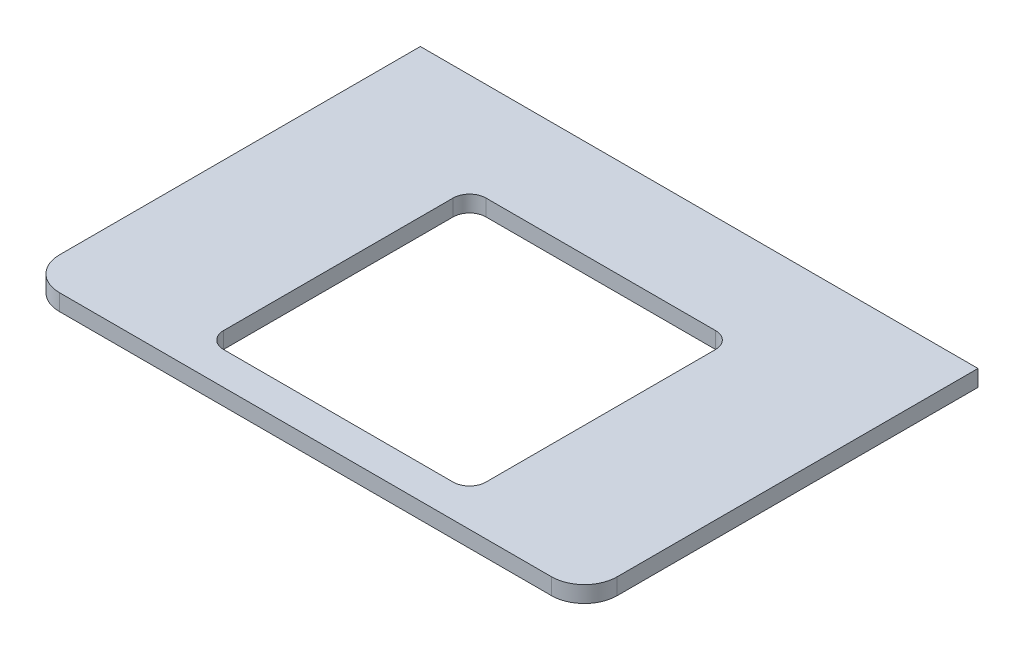
ISO-10303-21;
HEADER;
FILE_DESCRIPTION(('STEP AP214'),'2;1');
FILE_NAME('part.step','',(''),(''),'','','');
FILE_SCHEMA(('AUTOMOTIVE_DESIGN { 1 0 10303 214 1 1 1 1 }'));
ENDSEC;
DATA;
#1=APPLICATION_CONTEXT('core data for automotive mechanical design processes');
#2=APPLICATION_PROTOCOL_DEFINITION('international standard','automotive_design',2000,#1);
#3=PRODUCT_CONTEXT('',#1,'mechanical');
#4=PRODUCT('Part','Part','',(#3));
#5=PRODUCT_RELATED_PRODUCT_CATEGORY('part','',(#4));
#6=PRODUCT_DEFINITION_FORMATION('','',#4);
#7=PRODUCT_DEFINITION_CONTEXT('part definition',#1,'design');
#8=PRODUCT_DEFINITION('design','',#6,#7);
#9=PRODUCT_DEFINITION_SHAPE('','',#8);
#10=(LENGTH_UNIT() NAMED_UNIT(*) SI_UNIT(.MILLI.,.METRE.));
#11=(NAMED_UNIT(*) PLANE_ANGLE_UNIT() SI_UNIT($,.RADIAN.));
#12=(NAMED_UNIT(*) SI_UNIT($,.STERADIAN.) SOLID_ANGLE_UNIT());
#13=UNCERTAINTY_MEASURE_WITH_UNIT(LENGTH_MEASURE(1.E-05),#10,'distance_accuracy_value','');
#14=(GEOMETRIC_REPRESENTATION_CONTEXT(3) GLOBAL_UNCERTAINTY_ASSIGNED_CONTEXT((#13)) GLOBAL_UNIT_ASSIGNED_CONTEXT((#10,
#11,#12)) REPRESENTATION_CONTEXT('',''));
#15=CARTESIAN_POINT('',(0.,0.,0.));
#16=DIRECTION('',(0.,0.,1.));
#17=DIRECTION('',(1.,0.,0.));
#18=AXIS2_PLACEMENT_3D('',#15,#16,#17);
#19=CARTESIAN_POINT('',(107.95,6.35,-76.2));
#20=DIRECTION('',(-1.,0.,0.));
#21=DIRECTION('',(0.,0.,1.));
#22=AXIS2_PLACEMENT_3D('',#19,#20,#21);
#23=PLANE('',#22);
#24=DIRECTION('',(0.,0.,-1.));
#25=VECTOR('',#24,1.);
#26=CARTESIAN_POINT('',(107.95,6.35,-76.2));
#27=LINE('',#26,#25);
#28=CARTESIAN_POINT('',(107.95,6.35,63.4999999999999));
#29=VERTEX_POINT('',#28);
#30=CARTESIAN_POINT('',(107.95,6.35,-76.2));
#31=VERTEX_POINT('',#30);
#32=EDGE_CURVE('E233',#29,#31,#27,.T.);
#33=ORIENTED_EDGE('',*,*,#32,.F.);
#34=DIRECTION('',(0.,-1.,0.));
#35=VECTOR('',#34,1.);
#36=CARTESIAN_POINT('',(107.95,6.35,63.5));
#37=LINE('',#36,#35);
#38=CARTESIAN_POINT('',(107.95,0.,63.4999999999999));
#39=VERTEX_POINT('',#38);
#40=EDGE_CURVE('E268',#29,#39,#37,.T.);
#41=ORIENTED_EDGE('',*,*,#40,.T.);
#42=DIRECTION('',(0.,0.,-1.));
#43=VECTOR('',#42,1.);
#44=CARTESIAN_POINT('',(107.95,0.,-76.2));
#45=LINE('',#44,#43);
#46=CARTESIAN_POINT('',(107.95,0.,-76.2));
#47=VERTEX_POINT('',#46);
#48=EDGE_CURVE('E215',#39,#47,#45,.T.);
#49=ORIENTED_EDGE('',*,*,#48,.T.);
#50=DIRECTION('',(0.,-1.,0.));
#51=VECTOR('',#50,1.);
#52=CARTESIAN_POINT('',(107.95,6.35,-76.2));
#53=LINE('',#52,#51);
#54=EDGE_CURVE('E264',#31,#47,#53,.T.);
#55=ORIENTED_EDGE('',*,*,#54,.F.);
#56=EDGE_LOOP('',(#33,#41,#49,#55));
#57=FACE_BOUND('',#56,.T.);
#58=ADVANCED_FACE('F39',(#57),#23,.F.);
#59=CARTESIAN_POINT('',(-107.95,6.35,-76.2));
#60=DIRECTION('',(0.,0.,1.));
#61=DIRECTION('',(1.,0.,0.));
#62=AXIS2_PLACEMENT_3D('',#59,#60,#61);
#63=PLANE('',#62);
#64=DIRECTION('',(-1.,0.,0.));
#65=VECTOR('',#64,1.);
#66=CARTESIAN_POINT('',(-107.95,0.,-76.2));
#67=LINE('',#66,#65);
#68=CARTESIAN_POINT('',(-107.95,0.,-76.2));
#69=VERTEX_POINT('',#68);
#70=EDGE_CURVE('E251',#47,#69,#67,.T.);
#71=ORIENTED_EDGE('',*,*,#70,.T.);
#72=DIRECTION('',(0.,-1.,0.));
#73=VECTOR('',#72,1.);
#74=CARTESIAN_POINT('',(-107.95,6.35,-76.2));
#75=LINE('',#74,#73);
#76=CARTESIAN_POINT('',(-107.95,6.35,-76.2));
#77=VERTEX_POINT('',#76);
#78=EDGE_CURVE('E248',#77,#69,#75,.T.);
#79=ORIENTED_EDGE('',*,*,#78,.F.);
#80=DIRECTION('',(-1.,0.,0.));
#81=VECTOR('',#80,1.);
#82=CARTESIAN_POINT('',(-107.95,6.35,-76.2));
#83=LINE('',#82,#81);
#84=EDGE_CURVE('E236',#31,#77,#83,.T.);
#85=ORIENTED_EDGE('',*,*,#84,.F.);
#86=ORIENTED_EDGE('',*,*,#54,.T.);
#87=EDGE_LOOP('',(#71,#79,#85,#86));
#88=FACE_BOUND('',#87,.T.);
#89=ADVANCED_FACE('F315',(#88),#63,.F.);
#90=CARTESIAN_POINT('',(-107.95,6.35,-76.2));
#91=DIRECTION('',(1.,0.,0.));
#92=DIRECTION('',(0.,0.,-1.));
#93=AXIS2_PLACEMENT_3D('',#90,#91,#92);
#94=PLANE('',#93);
#95=DIRECTION('',(0.,0.,1.));
#96=VECTOR('',#95,1.);
#97=CARTESIAN_POINT('',(-107.95,0.,-76.2));
#98=LINE('',#97,#96);
#99=CARTESIAN_POINT('',(-107.95,0.,63.4999999999999));
#100=VERTEX_POINT('',#99);
#101=EDGE_CURVE('E254',#69,#100,#98,.T.);
#102=ORIENTED_EDGE('',*,*,#101,.T.);
#103=DIRECTION('',(0.,-1.,0.));
#104=VECTOR('',#103,1.);
#105=CARTESIAN_POINT('',(-107.95,6.35,63.5));
#106=LINE('',#105,#104);
#107=CARTESIAN_POINT('',(-107.95,6.35,63.4999999999999));
#108=VERTEX_POINT('',#107);
#109=EDGE_CURVE('E11',#100,#108,#106,.F.);
#110=ORIENTED_EDGE('',*,*,#109,.T.);
#111=DIRECTION('',(0.,0.,1.));
#112=VECTOR('',#111,1.);
#113=CARTESIAN_POINT('',(-107.95,6.35,-76.2));
#114=LINE('',#113,#112);
#115=EDGE_CURVE('E240',#77,#108,#114,.T.);
#116=ORIENTED_EDGE('',*,*,#115,.F.);
#117=ORIENTED_EDGE('',*,*,#78,.T.);
#118=EDGE_LOOP('',(#102,#110,#116,#117));
#119=FACE_BOUND('',#118,.T.);
#120=ADVANCED_FACE('F311',(#119),#94,.F.);
#121=CARTESIAN_POINT('',(-107.95,6.35,76.2));
#122=DIRECTION('',(0.,0.,-1.));
#123=DIRECTION('',(-1.,0.,0.));
#124=AXIS2_PLACEMENT_3D('',#121,#122,#123);
#125=PLANE('',#124);
#126=DIRECTION('',(1.,0.,0.));
#127=VECTOR('',#126,1.);
#128=CARTESIAN_POINT('',(-107.95,0.,76.2));
#129=LINE('',#128,#127);
#130=CARTESIAN_POINT('',(-95.25,0.,76.2));
#131=VERTEX_POINT('',#130);
#132=CARTESIAN_POINT('',(95.25,0.,76.2));
#133=VERTEX_POINT('',#132);
#134=EDGE_CURVE('E237',#131,#133,#129,.T.);
#135=ORIENTED_EDGE('',*,*,#134,.T.);
#136=DIRECTION('',(0.,-1.,0.));
#137=VECTOR('',#136,1.);
#138=CARTESIAN_POINT('',(95.25,6.35,76.2));
#139=LINE('',#138,#137);
#140=CARTESIAN_POINT('',(95.25,6.35,76.2));
#141=VERTEX_POINT('',#140);
#142=EDGE_CURVE('E282',#133,#141,#139,.F.);
#143=ORIENTED_EDGE('',*,*,#142,.T.);
#144=DIRECTION('',(1.,0.,0.));
#145=VECTOR('',#144,1.);
#146=CARTESIAN_POINT('',(-107.95,6.35,76.2));
#147=LINE('',#146,#145);
#148=CARTESIAN_POINT('',(-95.25,6.35,76.2));
#149=VERTEX_POINT('',#148);
#150=EDGE_CURVE('E244',#149,#141,#147,.T.);
#151=ORIENTED_EDGE('',*,*,#150,.F.);
#152=DIRECTION('',(0.,-1.,0.));
#153=VECTOR('',#152,1.);
#154=CARTESIAN_POINT('',(-95.25,6.35,76.2));
#155=LINE('',#154,#153);
#156=EDGE_CURVE('E278',#149,#131,#155,.T.);
#157=ORIENTED_EDGE('',*,*,#156,.T.);
#158=EDGE_LOOP('',(#135,#143,#151,#157));
#159=FACE_BOUND('',#158,.T.);
#160=ADVANCED_FACE('F304',(#159),#125,.F.);
#161=CARTESIAN_POINT('',(0.,6.35,0.));
#162=DIRECTION('',(0.,1.,0.));
#163=DIRECTION('',(0.,0.,1.));
#164=AXIS2_PLACEMENT_3D('',#161,#162,#163);
#165=PLANE('',#164);
#166=CARTESIAN_POINT('',(44.45,6.35,-31.75));
#167=DIRECTION('',(0.,1.,0.));
#168=DIRECTION('',(0.,0.,-1.));
#169=AXIS2_PLACEMENT_3D('',#166,#167,#168);
#170=CIRCLE('',#169,6.35);
#171=CARTESIAN_POINT('',(50.8,6.35,-31.75));
#172=VERTEX_POINT('',#171);
#173=CARTESIAN_POINT('',(44.45,6.35,-38.1));
#174=VERTEX_POINT('',#173);
#175=EDGE_CURVE('E55',#172,#174,#170,.T.);
#176=ORIENTED_EDGE('',*,*,#175,.F.);
#177=DIRECTION('',(0.,0.,-1.));
#178=VECTOR('',#177,1.);
#179=CARTESIAN_POINT('',(50.8,6.35,-31.75));
#180=LINE('',#179,#178);
#181=CARTESIAN_POINT('',(50.8000000000001,6.35,57.1499999999999));
#182=VERTEX_POINT('',#181);
#183=EDGE_CURVE('E162',#182,#172,#180,.T.);
#184=ORIENTED_EDGE('',*,*,#183,.F.);
#185=CARTESIAN_POINT('',(44.4500000000001,6.35,57.15));
#186=DIRECTION('',(0.,1.,0.));
#187=DIRECTION('',(0.,0.,1.));
#188=AXIS2_PLACEMENT_3D('',#185,#186,#187);
#189=CIRCLE('',#188,6.34999999999999);
#190=CARTESIAN_POINT('',(44.45,6.35,63.5));
#191=VERTEX_POINT('',#190);
#192=EDGE_CURVE('E166',#191,#182,#189,.T.);
#193=ORIENTED_EDGE('',*,*,#192,.F.);
#194=DIRECTION('',(1.,0.,0.));
#195=VECTOR('',#194,1.);
#196=CARTESIAN_POINT('',(-44.4499999999998,6.35,63.5));
#197=LINE('',#196,#195);
#198=CARTESIAN_POINT('',(-44.4499999999999,6.35,63.5));
#199=VERTEX_POINT('',#198);
#200=EDGE_CURVE('E205',#199,#191,#197,.T.);
#201=ORIENTED_EDGE('',*,*,#200,.F.);
#202=CARTESIAN_POINT('',(-44.4499999999999,6.35,57.15));
#203=DIRECTION('',(0.,1.,0.));
#204=DIRECTION('',(0.,0.,1.));
#205=AXIS2_PLACEMENT_3D('',#202,#203,#204);
#206=CIRCLE('',#205,6.35);
#207=CARTESIAN_POINT('',(-50.7999999999998,6.35,57.1499999999999));
#208=VERTEX_POINT('',#207);
#209=EDGE_CURVE('E201',#208,#199,#206,.T.);
#210=ORIENTED_EDGE('',*,*,#209,.F.);
#211=DIRECTION('',(0.,0.,1.));
#212=VECTOR('',#211,1.);
#213=CARTESIAN_POINT('',(-50.7999999999999,6.35,-31.75));
#214=LINE('',#213,#212);
#215=CARTESIAN_POINT('',(-50.7999999999999,6.35,-31.75));
#216=VERTEX_POINT('',#215);
#217=EDGE_CURVE('E197',#216,#208,#214,.T.);
#218=ORIENTED_EDGE('',*,*,#217,.F.);
#219=CARTESIAN_POINT('',(-44.4499999999999,6.35,-31.75));
#220=DIRECTION('',(0.,1.,0.));
#221=DIRECTION('',(0.,0.,1.));
#222=AXIS2_PLACEMENT_3D('',#219,#220,#221);
#223=CIRCLE('',#222,6.34999999999999);
#224=CARTESIAN_POINT('',(-44.4499999999998,6.35,-38.1));
#225=VERTEX_POINT('',#224);
#226=EDGE_CURVE('E193',#225,#216,#223,.T.);
#227=ORIENTED_EDGE('',*,*,#226,.F.);
#228=DIRECTION('',(-1.,0.,0.));
#229=VECTOR('',#228,1.);
#230=CARTESIAN_POINT('',(-44.4499999999998,6.35,-38.1));
#231=LINE('',#230,#229);
#232=EDGE_CURVE('E190',#174,#225,#231,.T.);
#233=ORIENTED_EDGE('',*,*,#232,.F.);
#234=EDGE_LOOP('',(#176,#184,#193,#201,#210,#218,#227,#233));
#235=FACE_BOUND('',#234,.T.);
#236=ORIENTED_EDGE('',*,*,#150,.T.);
#237=CARTESIAN_POINT('',(95.25,6.35,63.5));
#238=DIRECTION('',(0.,1.,0.));
#239=DIRECTION('',(0.,0.,1.));
#240=AXIS2_PLACEMENT_3D('',#237,#238,#239);
#241=CIRCLE('',#240,12.7);
#242=EDGE_CURVE('E48',#141,#29,#241,.T.);
#243=ORIENTED_EDGE('',*,*,#242,.T.);
#244=ORIENTED_EDGE('',*,*,#32,.T.);
#245=ORIENTED_EDGE('',*,*,#84,.T.);
#246=ORIENTED_EDGE('',*,*,#115,.T.);
#247=CARTESIAN_POINT('',(-95.25,6.35,63.5));
#248=DIRECTION('',(0.,1.,0.));
#249=DIRECTION('',(0.,0.,1.));
#250=AXIS2_PLACEMENT_3D('',#247,#248,#249);
#251=CIRCLE('',#250,12.7);
#252=EDGE_CURVE('E285',#108,#149,#251,.T.);
#253=ORIENTED_EDGE('',*,*,#252,.T.);
#254=EDGE_LOOP('',(#236,#243,#244,#245,#246,#253));
#255=FACE_BOUND('',#254,.T.);
#256=ADVANCED_FACE('F291',(#235,#255),#165,.T.);
#257=CARTESIAN_POINT('',(0.,0.,0.));
#258=DIRECTION('',(0.,1.,0.));
#259=DIRECTION('',(0.,0.,1.));
#260=AXIS2_PLACEMENT_3D('',#257,#258,#259);
#261=PLANE('',#260);
#262=DIRECTION('',(0.,0.,-1.));
#263=VECTOR('',#262,1.);
#264=CARTESIAN_POINT('',(50.8,0.,-31.75));
#265=LINE('',#264,#263);
#266=CARTESIAN_POINT('',(50.8000000000001,0.,57.1499999999999));
#267=VERTEX_POINT('',#266);
#268=CARTESIAN_POINT('',(50.8,0.,-31.75));
#269=VERTEX_POINT('',#268);
#270=EDGE_CURVE('E149',#267,#269,#265,.T.);
#271=ORIENTED_EDGE('',*,*,#270,.T.);
#272=CARTESIAN_POINT('',(44.45,0.,-31.75));
#273=DIRECTION('',(0.,1.,0.));
#274=DIRECTION('',(0.,0.,-1.));
#275=AXIS2_PLACEMENT_3D('',#272,#273,#274);
#276=CIRCLE('',#275,6.35);
#277=CARTESIAN_POINT('',(44.45,0.,-38.1));
#278=VERTEX_POINT('',#277);
#279=EDGE_CURVE('E142',#269,#278,#276,.T.);
#280=ORIENTED_EDGE('',*,*,#279,.T.);
#281=DIRECTION('',(-1.,0.,0.));
#282=VECTOR('',#281,1.);
#283=CARTESIAN_POINT('',(-44.4499999999998,0.,-38.1));
#284=LINE('',#283,#282);
#285=CARTESIAN_POINT('',(-44.4499999999998,0.,-38.1));
#286=VERTEX_POINT('',#285);
#287=EDGE_CURVE('E152',#278,#286,#284,.T.);
#288=ORIENTED_EDGE('',*,*,#287,.T.);
#289=CARTESIAN_POINT('',(-44.4499999999999,0.,-31.75));
#290=DIRECTION('',(0.,1.,0.));
#291=DIRECTION('',(0.,0.,1.));
#292=AXIS2_PLACEMENT_3D('',#289,#290,#291);
#293=CIRCLE('',#292,6.34999999999999);
#294=CARTESIAN_POINT('',(-50.7999999999999,0.,-31.75));
#295=VERTEX_POINT('',#294);
#296=EDGE_CURVE('E63',#286,#295,#293,.T.);
#297=ORIENTED_EDGE('',*,*,#296,.T.);
#298=DIRECTION('',(0.,0.,1.));
#299=VECTOR('',#298,1.);
#300=CARTESIAN_POINT('',(-50.7999999999999,0.,-31.75));
#301=LINE('',#300,#299);
#302=CARTESIAN_POINT('',(-50.7999999999998,0.,57.1499999999999));
#303=VERTEX_POINT('',#302);
#304=EDGE_CURVE('E171',#295,#303,#301,.T.);
#305=ORIENTED_EDGE('',*,*,#304,.T.);
#306=CARTESIAN_POINT('',(-44.4499999999999,0.,57.15));
#307=DIRECTION('',(0.,1.,0.));
#308=DIRECTION('',(0.,0.,1.));
#309=AXIS2_PLACEMENT_3D('',#306,#307,#308);
#310=CIRCLE('',#309,6.35);
#311=CARTESIAN_POINT('',(-44.4499999999999,0.,63.5));
#312=VERTEX_POINT('',#311);
#313=EDGE_CURVE('E175',#303,#312,#310,.T.);
#314=ORIENTED_EDGE('',*,*,#313,.T.);
#315=DIRECTION('',(1.,0.,0.));
#316=VECTOR('',#315,1.);
#317=CARTESIAN_POINT('',(-44.4499999999998,0.,63.5));
#318=LINE('',#317,#316);
#319=CARTESIAN_POINT('',(44.45,0.,63.5));
#320=VERTEX_POINT('',#319);
#321=EDGE_CURVE('E179',#312,#320,#318,.T.);
#322=ORIENTED_EDGE('',*,*,#321,.T.);
#323=CARTESIAN_POINT('',(44.4500000000001,0.,57.15));
#324=DIRECTION('',(0.,1.,0.));
#325=DIRECTION('',(0.,0.,1.));
#326=AXIS2_PLACEMENT_3D('',#323,#324,#325);
#327=CIRCLE('',#326,6.34999999999999);
#328=EDGE_CURVE('E183',#320,#267,#327,.T.);
#329=ORIENTED_EDGE('',*,*,#328,.T.);
#330=EDGE_LOOP('',(#271,#280,#288,#297,#305,#314,#322,#329));
#331=FACE_BOUND('',#330,.T.);
#332=ORIENTED_EDGE('',*,*,#48,.F.);
#333=CARTESIAN_POINT('',(95.25,0.,63.5));
#334=DIRECTION('',(0.,1.,0.));
#335=DIRECTION('',(0.,0.,1.));
#336=AXIS2_PLACEMENT_3D('',#333,#334,#335);
#337=CIRCLE('',#336,12.7);
#338=EDGE_CURVE('E275',#39,#133,#337,.F.);
#339=ORIENTED_EDGE('',*,*,#338,.T.);
#340=ORIENTED_EDGE('',*,*,#134,.F.);
#341=CARTESIAN_POINT('',(-95.25,0.,63.5));
#342=DIRECTION('',(0.,1.,0.));
#343=DIRECTION('',(0.,0.,1.));
#344=AXIS2_PLACEMENT_3D('',#341,#342,#343);
#345=CIRCLE('',#344,12.7);
#346=EDGE_CURVE('E272',#131,#100,#345,.F.);
#347=ORIENTED_EDGE('',*,*,#346,.T.);
#348=ORIENTED_EDGE('',*,*,#101,.F.);
#349=ORIENTED_EDGE('',*,*,#70,.F.);
#350=EDGE_LOOP('',(#332,#339,#340,#347,#348,#349));
#351=FACE_BOUND('',#350,.T.);
#352=ADVANCED_FACE('F157',(#331,#351),#261,.F.);
#353=CARTESIAN_POINT('',(95.25,6.35,63.5));
#354=DIRECTION('',(0.,-1.,0.));
#355=DIRECTION('',(0.,0.,-1.));
#356=AXIS2_PLACEMENT_3D('',#353,#354,#355);
#357=CYLINDRICAL_SURFACE('',#356,12.7);
#358=ORIENTED_EDGE('',*,*,#242,.F.);
#359=ORIENTED_EDGE('',*,*,#142,.F.);
#360=ORIENTED_EDGE('',*,*,#338,.F.);
#361=ORIENTED_EDGE('',*,*,#40,.F.);
#362=EDGE_LOOP('',(#358,#359,#360,#361));
#363=FACE_BOUND('',#362,.T.);
#364=ADVANCED_FACE('F300',(#363),#357,.T.);
#365=CARTESIAN_POINT('',(-95.25,6.35,63.5));
#366=DIRECTION('',(0.,-1.,0.));
#367=DIRECTION('',(0.,0.,-1.));
#368=AXIS2_PLACEMENT_3D('',#365,#366,#367);
#369=CYLINDRICAL_SURFACE('',#368,12.7);
#370=ORIENTED_EDGE('',*,*,#252,.F.);
#371=ORIENTED_EDGE('',*,*,#109,.F.);
#372=ORIENTED_EDGE('',*,*,#346,.F.);
#373=ORIENTED_EDGE('',*,*,#156,.F.);
#374=EDGE_LOOP('',(#370,#371,#372,#373));
#375=FACE_BOUND('',#374,.T.);
#376=ADVANCED_FACE('F41',(#375),#369,.T.);
#377=CARTESIAN_POINT('',(44.45,0.,-31.75));
#378=DIRECTION('',(0.,1.,0.));
#379=DIRECTION('',(0.,0.,1.));
#380=AXIS2_PLACEMENT_3D('',#377,#378,#379);
#381=CYLINDRICAL_SURFACE('',#380,6.35);
#382=ORIENTED_EDGE('',*,*,#175,.T.);
#383=DIRECTION('',(0.,1.,0.));
#384=VECTOR('',#383,1.);
#385=CARTESIAN_POINT('',(44.45,0.,-38.1));
#386=LINE('',#385,#384);
#387=EDGE_CURVE('E138',#278,#174,#386,.T.);
#388=ORIENTED_EDGE('',*,*,#387,.F.);
#389=ORIENTED_EDGE('',*,*,#279,.F.);
#390=DIRECTION('',(0.,1.,0.));
#391=VECTOR('',#390,1.);
#392=CARTESIAN_POINT('',(50.8,0.,-31.75));
#393=LINE('',#392,#391);
#394=EDGE_CURVE('E212',#269,#172,#393,.T.);
#395=ORIENTED_EDGE('',*,*,#394,.T.);
#396=EDGE_LOOP('',(#382,#388,#389,#395));
#397=FACE_BOUND('',#396,.T.);
#398=ADVANCED_FACE('F140',(#397),#381,.F.);
#399=CARTESIAN_POINT('',(50.8,0.,-31.75));
#400=DIRECTION('',(1.,0.,0.));
#401=DIRECTION('',(0.,0.,-1.));
#402=AXIS2_PLACEMENT_3D('',#399,#400,#401);
#403=PLANE('',#402);
#404=ORIENTED_EDGE('',*,*,#183,.T.);
#405=ORIENTED_EDGE('',*,*,#394,.F.);
#406=ORIENTED_EDGE('',*,*,#270,.F.);
#407=DIRECTION('',(0.,1.,0.));
#408=VECTOR('',#407,1.);
#409=CARTESIAN_POINT('',(50.8000000000001,0.,57.1499999999999));
#410=LINE('',#409,#408);
#411=EDGE_CURVE('E216',#267,#182,#410,.T.);
#412=ORIENTED_EDGE('',*,*,#411,.T.);
#413=EDGE_LOOP('',(#404,#405,#406,#412));
#414=FACE_BOUND('',#413,.T.);
#415=ADVANCED_FACE('F363',(#414),#403,.F.);
#416=CARTESIAN_POINT('',(44.4500000000001,0.,57.15));
#417=DIRECTION('',(0.,1.,0.));
#418=DIRECTION('',(0.,0.,1.));
#419=AXIS2_PLACEMENT_3D('',#416,#417,#418);
#420=CYLINDRICAL_SURFACE('',#419,6.34999999999999);
#421=ORIENTED_EDGE('',*,*,#192,.T.);
#422=ORIENTED_EDGE('',*,*,#411,.F.);
#423=ORIENTED_EDGE('',*,*,#328,.F.);
#424=DIRECTION('',(0.,1.,0.));
#425=VECTOR('',#424,1.);
#426=CARTESIAN_POINT('',(44.45,0.,63.5));
#427=LINE('',#426,#425);
#428=EDGE_CURVE('E219',#320,#191,#427,.T.);
#429=ORIENTED_EDGE('',*,*,#428,.T.);
#430=EDGE_LOOP('',(#421,#422,#423,#429));
#431=FACE_BOUND('',#430,.T.);
#432=ADVANCED_FACE('F371',(#431),#420,.F.);
#433=CARTESIAN_POINT('',(-44.4499999999998,0.,63.5));
#434=DIRECTION('',(0.,0.,1.));
#435=DIRECTION('',(1.,0.,0.));
#436=AXIS2_PLACEMENT_3D('',#433,#434,#435);
#437=PLANE('',#436);
#438=ORIENTED_EDGE('',*,*,#200,.T.);
#439=ORIENTED_EDGE('',*,*,#428,.F.);
#440=ORIENTED_EDGE('',*,*,#321,.F.);
#441=DIRECTION('',(0.,1.,0.));
#442=VECTOR('',#441,1.);
#443=CARTESIAN_POINT('',(-44.4499999999999,0.,63.5));
#444=LINE('',#443,#442);
#445=EDGE_CURVE('E222',#312,#199,#444,.T.);
#446=ORIENTED_EDGE('',*,*,#445,.T.);
#447=EDGE_LOOP('',(#438,#439,#440,#446));
#448=FACE_BOUND('',#447,.T.);
#449=ADVANCED_FACE('F381',(#448),#437,.F.);
#450=CARTESIAN_POINT('',(-44.4499999999999,0.,57.15));
#451=DIRECTION('',(0.,1.,0.));
#452=DIRECTION('',(0.,0.,1.));
#453=AXIS2_PLACEMENT_3D('',#450,#451,#452);
#454=CYLINDRICAL_SURFACE('',#453,6.35);
#455=ORIENTED_EDGE('',*,*,#209,.T.);
#456=ORIENTED_EDGE('',*,*,#445,.F.);
#457=ORIENTED_EDGE('',*,*,#313,.F.);
#458=DIRECTION('',(0.,1.,0.));
#459=VECTOR('',#458,1.);
#460=CARTESIAN_POINT('',(-50.7999999999998,0.,57.1499999999999));
#461=LINE('',#460,#459);
#462=EDGE_CURVE('E225',#303,#208,#461,.T.);
#463=ORIENTED_EDGE('',*,*,#462,.T.);
#464=EDGE_LOOP('',(#455,#456,#457,#463));
#465=FACE_BOUND('',#464,.T.);
#466=ADVANCED_FACE('F391',(#465),#454,.F.);
#467=CARTESIAN_POINT('',(-50.7999999999999,0.,-31.75));
#468=DIRECTION('',(-1.,0.,0.));
#469=DIRECTION('',(0.,0.,1.));
#470=AXIS2_PLACEMENT_3D('',#467,#468,#469);
#471=PLANE('',#470);
#472=ORIENTED_EDGE('',*,*,#217,.T.);
#473=ORIENTED_EDGE('',*,*,#462,.F.);
#474=ORIENTED_EDGE('',*,*,#304,.F.);
#475=DIRECTION('',(0.,1.,0.));
#476=VECTOR('',#475,1.);
#477=CARTESIAN_POINT('',(-50.7999999999999,0.,-31.75));
#478=LINE('',#477,#476);
#479=EDGE_CURVE('E228',#295,#216,#478,.T.);
#480=ORIENTED_EDGE('',*,*,#479,.T.);
#481=EDGE_LOOP('',(#472,#473,#474,#480));
#482=FACE_BOUND('',#481,.T.);
#483=ADVANCED_FACE('F401',(#482),#471,.F.);
#484=CARTESIAN_POINT('',(-44.4499999999999,0.,-31.75));
#485=DIRECTION('',(0.,1.,0.));
#486=DIRECTION('',(0.,0.,1.));
#487=AXIS2_PLACEMENT_3D('',#484,#485,#486);
#488=CYLINDRICAL_SURFACE('',#487,6.34999999999999);
#489=ORIENTED_EDGE('',*,*,#226,.T.);
#490=ORIENTED_EDGE('',*,*,#479,.F.);
#491=ORIENTED_EDGE('',*,*,#296,.F.);
#492=DIRECTION('',(0.,1.,0.));
#493=VECTOR('',#492,1.);
#494=CARTESIAN_POINT('',(-44.4499999999998,0.,-38.1));
#495=LINE('',#494,#493);
#496=EDGE_CURVE('E148',#286,#225,#495,.T.);
#497=ORIENTED_EDGE('',*,*,#496,.T.);
#498=EDGE_LOOP('',(#489,#490,#491,#497));
#499=FACE_BOUND('',#498,.T.);
#500=ADVANCED_FACE('F411',(#499),#488,.F.);
#501=CARTESIAN_POINT('',(-44.4499999999998,0.,-38.1));
#502=DIRECTION('',(0.,0.,-1.));
#503=DIRECTION('',(-1.,0.,0.));
#504=AXIS2_PLACEMENT_3D('',#501,#502,#503);
#505=PLANE('',#504);
#506=ORIENTED_EDGE('',*,*,#232,.T.);
#507=ORIENTED_EDGE('',*,*,#496,.F.);
#508=ORIENTED_EDGE('',*,*,#287,.F.);
#509=ORIENTED_EDGE('',*,*,#387,.T.);
#510=EDGE_LOOP('',(#506,#507,#508,#509));
#511=FACE_BOUND('',#510,.T.);
#512=ADVANCED_FACE('F153',(#511),#505,.F.);
#513=CLOSED_SHELL('',(#58,#89,#120,#160,#256,#352,#364,#376,#398,#415,#432,#449,#466,#483,#500,#512));
#514=MANIFOLD_SOLID_BREP('B2',#513);
#515=ADVANCED_BREP_SHAPE_REPRESENTATION('',(#18,#514),#14);
#516=SHAPE_DEFINITION_REPRESENTATION(#9,#515);
ENDSEC;
END-ISO-10303-21;
